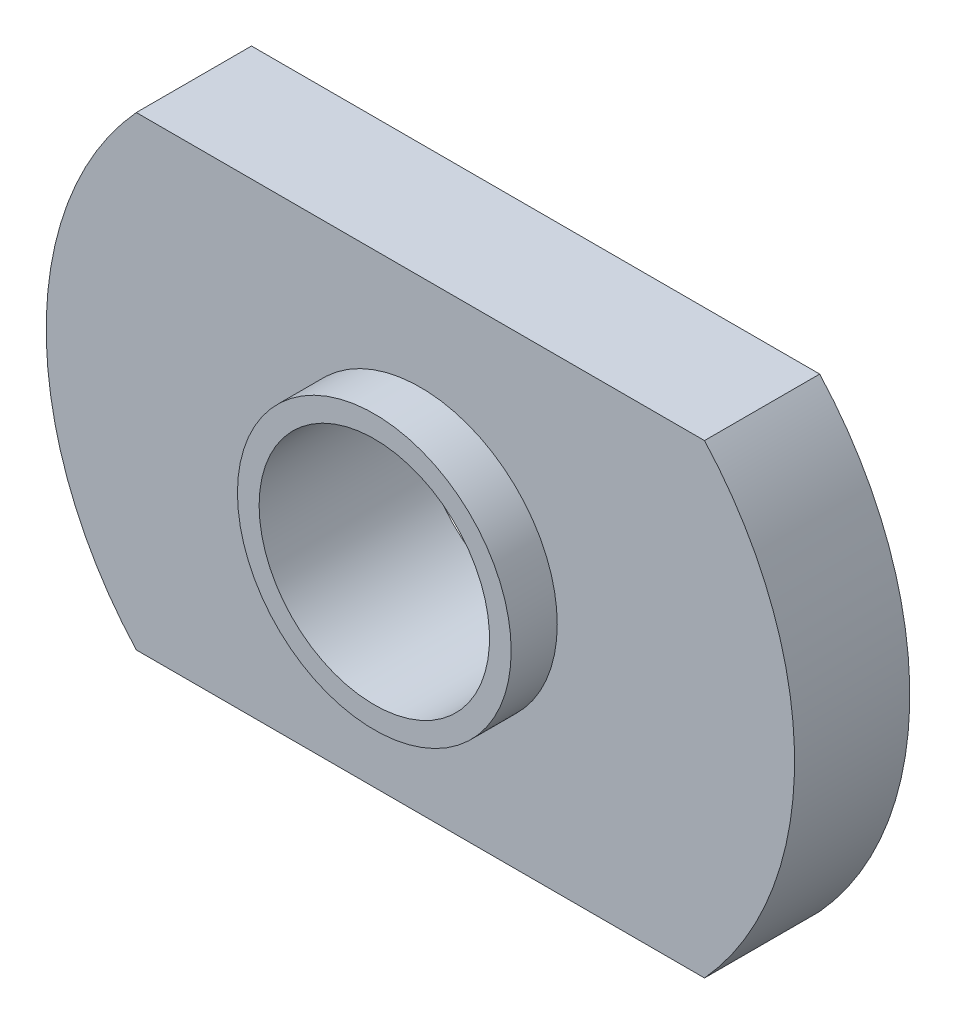
ISO-10303-21;
HEADER;
FILE_DESCRIPTION(('STEP AP214'),'2;1');
FILE_NAME('part.step','',(''),(''),'','','');
FILE_SCHEMA(('AUTOMOTIVE_DESIGN { 1 0 10303 214 1 1 1 1 }'));
ENDSEC;
DATA;
#1=APPLICATION_CONTEXT('core data for automotive mechanical design processes');
#2=APPLICATION_PROTOCOL_DEFINITION('international standard','automotive_design',2000,#1);
#3=PRODUCT_CONTEXT('',#1,'mechanical');
#4=PRODUCT('Part','Part','',(#3));
#5=PRODUCT_RELATED_PRODUCT_CATEGORY('part','',(#4));
#6=PRODUCT_DEFINITION_FORMATION('','',#4);
#7=PRODUCT_DEFINITION_CONTEXT('part definition',#1,'design');
#8=PRODUCT_DEFINITION('design','',#6,#7);
#9=PRODUCT_DEFINITION_SHAPE('','',#8);
#10=(LENGTH_UNIT() NAMED_UNIT(*) SI_UNIT(.MILLI.,.METRE.));
#11=(NAMED_UNIT(*) PLANE_ANGLE_UNIT() SI_UNIT($,.RADIAN.));
#12=(NAMED_UNIT(*) SI_UNIT($,.STERADIAN.) SOLID_ANGLE_UNIT());
#13=UNCERTAINTY_MEASURE_WITH_UNIT(LENGTH_MEASURE(1.E-05),#10,'distance_accuracy_value','');
#14=(GEOMETRIC_REPRESENTATION_CONTEXT(3) GLOBAL_UNCERTAINTY_ASSIGNED_CONTEXT((#13)) GLOBAL_UNIT_ASSIGNED_CONTEXT((#10,
#11,#12)) REPRESENTATION_CONTEXT('',''));
#15=CARTESIAN_POINT('',(0.,0.,0.));
#16=DIRECTION('',(0.,0.,1.));
#17=DIRECTION('',(1.,0.,0.));
#18=AXIS2_PLACEMENT_3D('',#15,#16,#17);
#19=CARTESIAN_POINT('',(112.853462660247,126.720465895994,3.175));
#20=DIRECTION('',(0.,0.,1.));
#21=DIRECTION('',(1.,0.,0.));
#22=AXIS2_PLACEMENT_3D('',#19,#20,#21);
#23=PLANE('',#22);
#24=CARTESIAN_POINT('',(112.853462660247,126.720465895994,3.175));
#25=DIRECTION('',(0.,0.,1.));
#26=DIRECTION('',(1.,0.,0.));
#27=AXIS2_PLACEMENT_3D('',#24,#25,#26);
#28=CIRCLE('',#27,9.525);
#29=CARTESIAN_POINT('',(119.895667055889,120.306965895994,3.175));
#30=VERTEX_POINT('',#29);
#31=CARTESIAN_POINT('',(119.895667055889,133.133965895994,3.175));
#32=VERTEX_POINT('',#31);
#33=EDGE_CURVE('E69',#30,#32,#28,.T.);
#34=ORIENTED_EDGE('',*,*,#33,.T.);
#35=DIRECTION('',(-1.,0.,0.));
#36=VECTOR('',#35,1.);
#37=CARTESIAN_POINT('',(104.236458264605,133.133965895994,3.175));
#38=LINE('',#37,#36);
#39=CARTESIAN_POINT('',(104.236458264605,133.133965895994,3.175));
#40=VERTEX_POINT('',#39);
#41=EDGE_CURVE('E64',#32,#40,#38,.T.);
#42=ORIENTED_EDGE('',*,*,#41,.T.);
#43=CARTESIAN_POINT('',(111.278662660247,126.720465895994,3.175));
#44=DIRECTION('',(0.,0.,1.));
#45=DIRECTION('',(-1.,0.,0.));
#46=AXIS2_PLACEMENT_3D('',#43,#44,#45);
#47=CIRCLE('',#46,9.525);
#48=CARTESIAN_POINT('',(104.236458264605,120.306965895994,3.175));
#49=VERTEX_POINT('',#48);
#50=EDGE_CURVE('E67',#40,#49,#47,.T.);
#51=ORIENTED_EDGE('',*,*,#50,.T.);
#52=DIRECTION('',(1.,0.,0.));
#53=VECTOR('',#52,1.);
#54=CARTESIAN_POINT('',(104.236458264605,120.306965895994,3.175));
#55=LINE('',#54,#53);
#56=EDGE_CURVE('E34',#49,#30,#55,.T.);
#57=ORIENTED_EDGE('',*,*,#56,.T.);
#58=EDGE_LOOP('',(#34,#42,#51,#57));
#59=FACE_BOUND('',#58,.T.);
#60=CARTESIAN_POINT('',(112.066062660247,126.720465895994,3.175));
#61=DIRECTION('',(0.,0.,1.));
#62=DIRECTION('',(1.,0.,0.));
#63=AXIS2_PLACEMENT_3D('',#60,#61,#62);
#64=CIRCLE('',#63,3.7719);
#65=CARTESIAN_POINT('',(115.837962660247,126.720465895994,3.175));
#66=VERTEX_POINT('',#65);
#67=EDGE_CURVE('E95',#66,#66,#64,.T.);
#68=ORIENTED_EDGE('',*,*,#67,.F.);
#69=EDGE_LOOP('',(#68));
#70=FACE_BOUND('',#69,.T.);
#71=ADVANCED_FACE('F17',(#59,#70),#23,.T.);
#72=CARTESIAN_POINT('',(112.853462660247,126.720465895994,3.175));
#73=DIRECTION('',(0.,0.,-1.));
#74=DIRECTION('',(-1.,0.,0.));
#75=AXIS2_PLACEMENT_3D('',#72,#73,#74);
#76=CYLINDRICAL_SURFACE('',#75,9.525);
#77=CARTESIAN_POINT('',(112.853462660247,126.720465895994,0.));
#78=DIRECTION('',(0.,0.,1.));
#79=DIRECTION('',(1.,0.,0.));
#80=AXIS2_PLACEMENT_3D('',#77,#78,#79);
#81=CIRCLE('',#80,9.525);
#82=CARTESIAN_POINT('',(119.895667055889,120.306965895994,0.));
#83=VERTEX_POINT('',#82);
#84=CARTESIAN_POINT('',(119.895667055889,133.133965895994,0.));
#85=VERTEX_POINT('',#84);
#86=EDGE_CURVE('E81',#83,#85,#81,.T.);
#87=ORIENTED_EDGE('',*,*,#86,.T.);
#88=DIRECTION('',(0.,0.,-1.));
#89=VECTOR('',#88,1.);
#90=CARTESIAN_POINT('',(119.895667055889,133.133965895994,3.175));
#91=LINE('',#90,#89);
#92=EDGE_CURVE('E11',#32,#85,#91,.T.);
#93=ORIENTED_EDGE('',*,*,#92,.F.);
#94=ORIENTED_EDGE('',*,*,#33,.F.);
#95=DIRECTION('',(0.,0.,-1.));
#96=VECTOR('',#95,1.);
#97=CARTESIAN_POINT('',(119.895667055889,120.306965895994,3.175));
#98=LINE('',#97,#96);
#99=EDGE_CURVE('E77',#30,#83,#98,.T.);
#100=ORIENTED_EDGE('',*,*,#99,.T.);
#101=EDGE_LOOP('',(#87,#93,#94,#100));
#102=FACE_BOUND('',#101,.T.);
#103=ADVANCED_FACE('F19',(#102),#76,.T.);
#104=CARTESIAN_POINT('',(104.236458264605,133.133965895994,3.175));
#105=DIRECTION('',(0.,-1.,0.));
#106=DIRECTION('',(0.,0.,-1.));
#107=AXIS2_PLACEMENT_3D('',#104,#105,#106);
#108=PLANE('',#107);
#109=DIRECTION('',(-1.,0.,0.));
#110=VECTOR('',#109,1.);
#111=CARTESIAN_POINT('',(104.236458264605,133.133965895994,0.));
#112=LINE('',#111,#110);
#113=CARTESIAN_POINT('',(104.236458264605,133.133965895994,0.));
#114=VERTEX_POINT('',#113);
#115=EDGE_CURVE('E73',#85,#114,#112,.T.);
#116=ORIENTED_EDGE('',*,*,#115,.T.);
#117=DIRECTION('',(0.,0.,-1.));
#118=VECTOR('',#117,1.);
#119=CARTESIAN_POINT('',(104.236458264605,133.133965895994,3.175));
#120=LINE('',#119,#118);
#121=EDGE_CURVE('E26',#40,#114,#120,.T.);
#122=ORIENTED_EDGE('',*,*,#121,.F.);
#123=ORIENTED_EDGE('',*,*,#41,.F.);
#124=ORIENTED_EDGE('',*,*,#92,.T.);
#125=EDGE_LOOP('',(#116,#122,#123,#124));
#126=FACE_BOUND('',#125,.T.);
#127=ADVANCED_FACE('F72',(#126),#108,.F.);
#128=CARTESIAN_POINT('',(111.278662660247,126.720465895994,3.175));
#129=DIRECTION('',(0.,0.,-1.));
#130=DIRECTION('',(-1.,0.,0.));
#131=AXIS2_PLACEMENT_3D('',#128,#129,#130);
#132=CYLINDRICAL_SURFACE('',#131,9.525);
#133=CARTESIAN_POINT('',(111.278662660247,126.720465895994,0.));
#134=DIRECTION('',(0.,0.,1.));
#135=DIRECTION('',(-1.,0.,0.));
#136=AXIS2_PLACEMENT_3D('',#133,#134,#135);
#137=CIRCLE('',#136,9.525);
#138=CARTESIAN_POINT('',(104.236458264605,120.306965895994,0.));
#139=VERTEX_POINT('',#138);
#140=EDGE_CURVE('E51',#114,#139,#137,.T.);
#141=ORIENTED_EDGE('',*,*,#140,.T.);
#142=DIRECTION('',(0.,0.,-1.));
#143=VECTOR('',#142,1.);
#144=CARTESIAN_POINT('',(104.236458264605,120.306965895994,3.175));
#145=LINE('',#144,#143);
#146=EDGE_CURVE('E74',#49,#139,#145,.T.);
#147=ORIENTED_EDGE('',*,*,#146,.F.);
#148=ORIENTED_EDGE('',*,*,#50,.F.);
#149=ORIENTED_EDGE('',*,*,#121,.T.);
#150=EDGE_LOOP('',(#141,#147,#148,#149));
#151=FACE_BOUND('',#150,.T.);
#152=ADVANCED_FACE('F75',(#151),#132,.T.);
#153=CARTESIAN_POINT('',(104.236458264605,120.306965895994,3.175));
#154=DIRECTION('',(0.,1.,0.));
#155=DIRECTION('',(0.,0.,1.));
#156=AXIS2_PLACEMENT_3D('',#153,#154,#155);
#157=PLANE('',#156);
#158=DIRECTION('',(1.,0.,0.));
#159=VECTOR('',#158,1.);
#160=CARTESIAN_POINT('',(104.236458264605,120.306965895994,0.));
#161=LINE('',#160,#159);
#162=EDGE_CURVE('E57',#139,#83,#161,.T.);
#163=ORIENTED_EDGE('',*,*,#162,.T.);
#164=ORIENTED_EDGE('',*,*,#99,.F.);
#165=ORIENTED_EDGE('',*,*,#56,.F.);
#166=ORIENTED_EDGE('',*,*,#146,.T.);
#167=EDGE_LOOP('',(#163,#164,#165,#166));
#168=FACE_BOUND('',#167,.T.);
#169=ADVANCED_FACE('F89',(#168),#157,.F.);
#170=CARTESIAN_POINT('',(112.853462660247,126.720465895994,0.));
#171=DIRECTION('',(0.,0.,1.));
#172=DIRECTION('',(1.,0.,0.));
#173=AXIS2_PLACEMENT_3D('',#170,#171,#172);
#174=PLANE('',#173);
#175=CARTESIAN_POINT('',(112.066062660247,126.720465895994,0.));
#176=DIRECTION('',(0.,0.,-1.));
#177=DIRECTION('',(-1.,0.,0.));
#178=AXIS2_PLACEMENT_3D('',#175,#176,#177);
#179=CIRCLE('',#178,3.175);
#180=CARTESIAN_POINT('',(108.891062660247,126.720465895994,0.));
#181=VERTEX_POINT('',#180);
#182=EDGE_CURVE('E101',#181,#181,#179,.T.);
#183=ORIENTED_EDGE('',*,*,#182,.F.);
#184=EDGE_LOOP('',(#183));
#185=FACE_BOUND('',#184,.T.);
#186=ORIENTED_EDGE('',*,*,#86,.F.);
#187=ORIENTED_EDGE('',*,*,#162,.F.);
#188=ORIENTED_EDGE('',*,*,#140,.F.);
#189=ORIENTED_EDGE('',*,*,#115,.F.);
#190=EDGE_LOOP('',(#186,#187,#188,#189));
#191=FACE_BOUND('',#190,.T.);
#192=ADVANCED_FACE('F92',(#185,#191),#174,.F.);
#193=CARTESIAN_POINT('',(112.066062660247,126.720465895994,4.445));
#194=DIRECTION('',(0.,0.,-1.));
#195=DIRECTION('',(-1.,0.,0.));
#196=AXIS2_PLACEMENT_3D('',#193,#194,#195);
#197=CYLINDRICAL_SURFACE('',#196,3.7719);
#198=CARTESIAN_POINT('',(112.066062660247,126.720465895994,4.445));
#199=DIRECTION('',(0.,0.,1.));
#200=DIRECTION('',(1.,0.,0.));
#201=AXIS2_PLACEMENT_3D('',#198,#199,#200);
#202=CIRCLE('',#201,3.7719);
#203=CARTESIAN_POINT('',(115.837962660247,126.720465895994,4.445));
#204=VERTEX_POINT('',#203);
#205=EDGE_CURVE('E84',#204,#204,#202,.T.);
#206=ORIENTED_EDGE('',*,*,#205,.F.);
#207=EDGE_LOOP('',(#206));
#208=FACE_BOUND('',#207,.T.);
#209=ORIENTED_EDGE('',*,*,#67,.T.);
#210=EDGE_LOOP('',(#209));
#211=FACE_BOUND('',#210,.T.);
#212=ADVANCED_FACE('F117',(#208,#211),#197,.T.);
#213=CARTESIAN_POINT('',(112.066062660247,126.720465895994,4.445));
#214=DIRECTION('',(0.,0.,1.));
#215=DIRECTION('',(1.,0.,0.));
#216=AXIS2_PLACEMENT_3D('',#213,#214,#215);
#217=PLANE('',#216);
#218=CARTESIAN_POINT('',(112.066062660247,126.720465895994,4.445));
#219=DIRECTION('',(0.,0.,-1.));
#220=DIRECTION('',(-1.,0.,0.));
#221=AXIS2_PLACEMENT_3D('',#218,#219,#220);
#222=CIRCLE('',#221,3.175);
#223=CARTESIAN_POINT('',(108.891062660247,126.720465895994,4.445));
#224=VERTEX_POINT('',#223);
#225=EDGE_CURVE('E98',#224,#224,#222,.T.);
#226=ORIENTED_EDGE('',*,*,#225,.T.);
#227=EDGE_LOOP('',(#226));
#228=FACE_BOUND('',#227,.T.);
#229=ORIENTED_EDGE('',*,*,#205,.T.);
#230=EDGE_LOOP('',(#229));
#231=FACE_BOUND('',#230,.T.);
#232=ADVANCED_FACE('F107',(#228,#231),#217,.T.);
#233=CARTESIAN_POINT('',(112.066062660247,126.720465895994,4.445));
#234=DIRECTION('',(0.,0.,-1.));
#235=DIRECTION('',(-1.,0.,0.));
#236=AXIS2_PLACEMENT_3D('',#233,#234,#235);
#237=CYLINDRICAL_SURFACE('',#236,3.175);
#238=ORIENTED_EDGE('',*,*,#225,.F.);
#239=EDGE_LOOP('',(#238));
#240=FACE_BOUND('',#239,.T.);
#241=ORIENTED_EDGE('',*,*,#182,.T.);
#242=EDGE_LOOP('',(#241));
#243=FACE_BOUND('',#242,.T.);
#244=ADVANCED_FACE('F110',(#240,#243),#237,.F.);
#245=CLOSED_SHELL('',(#71,#103,#127,#152,#169,#192,#212,#232,#244));
#246=MANIFOLD_SOLID_BREP('B1',#245);
#247=ADVANCED_BREP_SHAPE_REPRESENTATION('',(#18,#246),#14);
#248=SHAPE_DEFINITION_REPRESENTATION(#9,#247);
ENDSEC;
END-ISO-10303-21;
